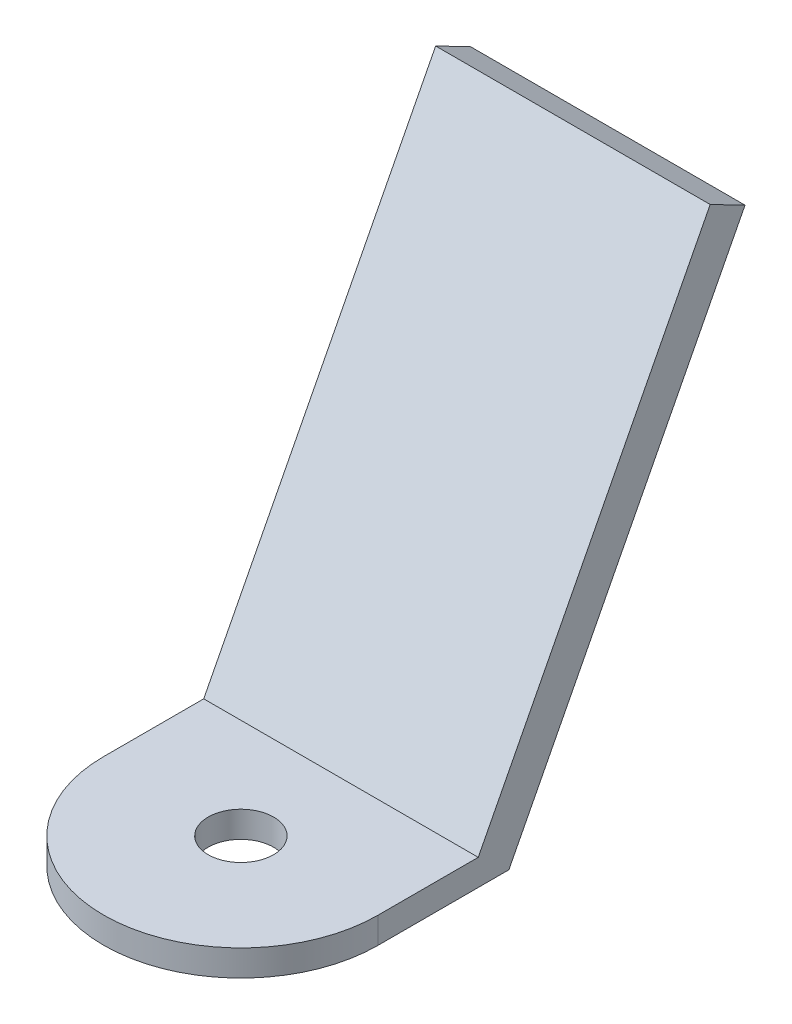
ISO-10303-21;
HEADER;
FILE_DESCRIPTION(('STEP AP214'),'2;1');
FILE_NAME('part.step','',(''),(''),'','','');
FILE_SCHEMA(('AUTOMOTIVE_DESIGN { 1 0 10303 214 1 1 1 1 }'));
ENDSEC;
DATA;
#1=APPLICATION_CONTEXT('core data for automotive mechanical design processes');
#2=APPLICATION_PROTOCOL_DEFINITION('international standard','automotive_design',2000,#1);
#3=PRODUCT_CONTEXT('',#1,'mechanical');
#4=PRODUCT('Part','Part','',(#3));
#5=PRODUCT_RELATED_PRODUCT_CATEGORY('part','',(#4));
#6=PRODUCT_DEFINITION_FORMATION('','',#4);
#7=PRODUCT_DEFINITION_CONTEXT('part definition',#1,'design');
#8=PRODUCT_DEFINITION('design','',#6,#7);
#9=PRODUCT_DEFINITION_SHAPE('','',#8);
#10=(LENGTH_UNIT() NAMED_UNIT(*) SI_UNIT(.MILLI.,.METRE.));
#11=(NAMED_UNIT(*) PLANE_ANGLE_UNIT() SI_UNIT($,.RADIAN.));
#12=(NAMED_UNIT(*) SI_UNIT($,.STERADIAN.) SOLID_ANGLE_UNIT());
#13=UNCERTAINTY_MEASURE_WITH_UNIT(LENGTH_MEASURE(1.E-05),#10,'distance_accuracy_value','');
#14=(GEOMETRIC_REPRESENTATION_CONTEXT(3) GLOBAL_UNCERTAINTY_ASSIGNED_CONTEXT((#13)) GLOBAL_UNIT_ASSIGNED_CONTEXT((#10,
#11,#12)) REPRESENTATION_CONTEXT('',''));
#15=CARTESIAN_POINT('',(0.,0.,0.));
#16=DIRECTION('',(0.,0.,1.));
#17=DIRECTION('',(1.,0.,0.));
#18=AXIS2_PLACEMENT_3D('',#15,#16,#17);
#19=CARTESIAN_POINT('',(0.,2.,0.));
#20=DIRECTION('',(0.,1.,0.));
#21=DIRECTION('',(0.,0.,1.));
#22=AXIS2_PLACEMENT_3D('',#19,#20,#21);
#23=PLANE('',#22);
#24=DIRECTION('',(1.,0.,0.));
#25=VECTOR('',#24,1.);
#26=CARTESIAN_POINT('',(0.,2.,-7.65624979912322));
#27=LINE('',#26,#25);
#28=CARTESIAN_POINT('',(-10.5,1.99999999999999,-7.65624979912322));
#29=VERTEX_POINT('',#28);
#30=CARTESIAN_POINT('',(10.5,1.99999999999999,-7.65624979912322));
#31=VERTEX_POINT('',#30);
#32=EDGE_CURVE('E119',#29,#31,#27,.T.);
#33=ORIENTED_EDGE('',*,*,#32,.F.);
#34=DIRECTION('',(0.,0.,1.));
#35=VECTOR('',#34,1.);
#36=CARTESIAN_POINT('',(-10.5,2.,0.));
#37=LINE('',#36,#35);
#38=CARTESIAN_POINT('',(-10.5,2.,0.));
#39=VERTEX_POINT('',#38);
#40=EDGE_CURVE('E57',#29,#39,#37,.T.);
#41=ORIENTED_EDGE('',*,*,#40,.T.);
#42=CARTESIAN_POINT('',(0.,2.,0.));
#43=DIRECTION('',(0.,1.,0.));
#44=DIRECTION('',(0.,0.,1.));
#45=AXIS2_PLACEMENT_3D('',#42,#43,#44);
#46=CIRCLE('',#45,10.5);
#47=CARTESIAN_POINT('',(10.5,2.,0.));
#48=VERTEX_POINT('',#47);
#49=EDGE_CURVE('E86',#39,#48,#46,.T.);
#50=ORIENTED_EDGE('',*,*,#49,.T.);
#51=DIRECTION('',(0.,0.,-1.));
#52=VECTOR('',#51,1.);
#53=CARTESIAN_POINT('',(10.5,2.,-10.));
#54=LINE('',#53,#52);
#55=EDGE_CURVE('E112',#48,#31,#54,.T.);
#56=ORIENTED_EDGE('',*,*,#55,.T.);
#57=EDGE_LOOP('',(#33,#41,#50,#56));
#58=FACE_BOUND('',#57,.T.);
#59=CARTESIAN_POINT('',(0.,2.,0.));
#60=DIRECTION('',(0.,1.,0.));
#61=DIRECTION('',(0.,0.,1.));
#62=AXIS2_PLACEMENT_3D('',#59,#60,#61);
#63=CIRCLE('',#62,2.5);
#64=CARTESIAN_POINT('',(0.,2.,2.5));
#65=VERTEX_POINT('',#64);
#66=EDGE_CURVE('E98',#65,#65,#63,.T.);
#67=ORIENTED_EDGE('',*,*,#66,.F.);
#68=EDGE_LOOP('',(#67));
#69=FACE_BOUND('',#68,.T.);
#70=ADVANCED_FACE('F39',(#58,#69),#23,.T.);
#71=CARTESIAN_POINT('',(0.,0.,0.));
#72=DIRECTION('',(0.,1.,0.));
#73=DIRECTION('',(0.,0.,1.));
#74=AXIS2_PLACEMENT_3D('',#71,#72,#73);
#75=PLANE('',#74);
#76=CARTESIAN_POINT('',(0.,0.,0.));
#77=DIRECTION('',(0.,1.,0.));
#78=DIRECTION('',(0.,0.,1.));
#79=AXIS2_PLACEMENT_3D('',#76,#77,#78);
#80=CIRCLE('',#79,10.5);
#81=CARTESIAN_POINT('',(-10.5,0.,0.));
#82=VERTEX_POINT('',#81);
#83=CARTESIAN_POINT('',(10.5,0.,0.));
#84=VERTEX_POINT('',#83);
#85=EDGE_CURVE('E91',#82,#84,#80,.T.);
#86=ORIENTED_EDGE('',*,*,#85,.F.);
#87=DIRECTION('',(0.,0.,1.));
#88=VECTOR('',#87,1.);
#89=CARTESIAN_POINT('',(-10.5,0.,0.));
#90=LINE('',#89,#88);
#91=CARTESIAN_POINT('',(-10.5,0.,-10.));
#92=VERTEX_POINT('',#91);
#93=EDGE_CURVE('E77',#92,#82,#90,.T.);
#94=ORIENTED_EDGE('',*,*,#93,.F.);
#95=DIRECTION('',(-1.,0.,0.));
#96=VECTOR('',#95,1.);
#97=CARTESIAN_POINT('',(-10.5,0.,-10.));
#98=LINE('',#97,#96);
#99=CARTESIAN_POINT('',(10.5,0.,-10.));
#100=VERTEX_POINT('',#99);
#101=EDGE_CURVE('E72',#100,#92,#98,.T.);
#102=ORIENTED_EDGE('',*,*,#101,.F.);
#103=DIRECTION('',(0.,0.,-1.));
#104=VECTOR('',#103,1.);
#105=CARTESIAN_POINT('',(10.5,0.,-10.));
#106=LINE('',#105,#104);
#107=EDGE_CURVE('E96',#84,#100,#106,.T.);
#108=ORIENTED_EDGE('',*,*,#107,.F.);
#109=EDGE_LOOP('',(#86,#94,#102,#108));
#110=FACE_BOUND('',#109,.T.);
#111=CARTESIAN_POINT('',(0.,0.,0.));
#112=DIRECTION('',(0.,1.,0.));
#113=DIRECTION('',(0.,0.,1.));
#114=AXIS2_PLACEMENT_3D('',#111,#112,#113);
#115=CIRCLE('',#114,2.5);
#116=CARTESIAN_POINT('',(0.,0.,2.5));
#117=VERTEX_POINT('',#116);
#118=EDGE_CURVE('E104',#117,#117,#115,.T.);
#119=ORIENTED_EDGE('',*,*,#118,.T.);
#120=EDGE_LOOP('',(#119));
#121=FACE_BOUND('',#120,.T.);
#122=ADVANCED_FACE('F93',(#110,#121),#75,.F.);
#123=CARTESIAN_POINT('',(0.,2.,0.));
#124=DIRECTION('',(0.,-1.,0.));
#125=DIRECTION('',(0.,0.,-1.));
#126=AXIS2_PLACEMENT_3D('',#123,#124,#125);
#127=CYLINDRICAL_SURFACE('',#126,10.5);
#128=ORIENTED_EDGE('',*,*,#85,.T.);
#129=DIRECTION('',(0.,-1.,0.));
#130=VECTOR('',#129,1.);
#131=CARTESIAN_POINT('',(10.5,2.,0.));
#132=LINE('',#131,#130);
#133=EDGE_CURVE('E11',#48,#84,#132,.T.);
#134=ORIENTED_EDGE('',*,*,#133,.F.);
#135=ORIENTED_EDGE('',*,*,#49,.F.);
#136=DIRECTION('',(0.,-1.,0.));
#137=VECTOR('',#136,1.);
#138=CARTESIAN_POINT('',(-10.5,2.,0.));
#139=LINE('',#138,#137);
#140=EDGE_CURVE('E49',#39,#82,#139,.T.);
#141=ORIENTED_EDGE('',*,*,#140,.T.);
#142=EDGE_LOOP('',(#128,#134,#135,#141));
#143=FACE_BOUND('',#142,.T.);
#144=ADVANCED_FACE('F41',(#143),#127,.T.);
#145=CARTESIAN_POINT('',(10.5,2.,-10.));
#146=DIRECTION('',(-1.,0.,0.));
#147=DIRECTION('',(0.,0.,1.));
#148=AXIS2_PLACEMENT_3D('',#145,#146,#147);
#149=PLANE('',#148);
#150=ORIENTED_EDGE('',*,*,#107,.T.);
#151=DIRECTION('',(0.,0.888614572242532,-0.458654708902265));
#152=VECTOR('',#151,1.);
#153=CARTESIAN_POINT('',(10.5,19.2,-19.91));
#154=LINE('',#153,#152);
#155=CARTESIAN_POINT('',(10.5,35.,-28.0651041666667));
#156=VERTEX_POINT('',#155);
#157=EDGE_CURVE('E144',#100,#156,#154,.T.);
#158=ORIENTED_EDGE('',*,*,#157,.T.);
#159=DIRECTION('',(0.,0.458654708902266,0.888614572242531));
#160=VECTOR('',#159,1.);
#161=CARTESIAN_POINT('',(10.5,35.,-28.0651041666667));
#162=LINE('',#161,#160);
#163=CARTESIAN_POINT('',(10.5,36.3759641267068,-25.3992604499391));
#164=VERTEX_POINT('',#163);
#165=EDGE_CURVE('E140',#156,#164,#162,.T.);
#166=ORIENTED_EDGE('',*,*,#165,.T.);
#167=DIRECTION('',(0.,-0.888614572242532,0.458654708902265));
#168=VECTOR('',#167,1.);
#169=CARTESIAN_POINT('',(10.5,36.3759641267068,-25.3992604499391));
#170=LINE('',#169,#168);
#171=EDGE_CURVE('E132',#164,#31,#170,.T.);
#172=ORIENTED_EDGE('',*,*,#171,.T.);
#173=ORIENTED_EDGE('',*,*,#55,.F.);
#174=ORIENTED_EDGE('',*,*,#133,.T.);
#175=EDGE_LOOP('',(#150,#158,#166,#172,#173,#174));
#176=FACE_BOUND('',#175,.T.);
#177=ADVANCED_FACE('F183',(#176),#149,.F.);
#178=CARTESIAN_POINT('',(-10.5,2.,0.));
#179=DIRECTION('',(1.,0.,0.));
#180=DIRECTION('',(0.,0.,-1.));
#181=AXIS2_PLACEMENT_3D('',#178,#179,#180);
#182=PLANE('',#181);
#183=ORIENTED_EDGE('',*,*,#40,.F.);
#184=DIRECTION('',(0.,0.888614572242532,-0.458654708902265));
#185=VECTOR('',#184,1.);
#186=CARTESIAN_POINT('',(-10.5,36.3759641267068,-25.3992604499391));
#187=LINE('',#186,#185);
#188=CARTESIAN_POINT('',(-10.5,36.3759641267068,-25.3992604499391));
#189=VERTEX_POINT('',#188);
#190=EDGE_CURVE('E126',#29,#189,#187,.T.);
#191=ORIENTED_EDGE('',*,*,#190,.T.);
#192=DIRECTION('',(0.,-0.458654708902267,-0.888614572242532));
#193=VECTOR('',#192,1.);
#194=CARTESIAN_POINT('',(-10.5,35.,-28.0651041666667));
#195=LINE('',#194,#193);
#196=CARTESIAN_POINT('',(-10.5,35.,-28.0651041666667));
#197=VERTEX_POINT('',#196);
#198=EDGE_CURVE('E136',#189,#197,#195,.T.);
#199=ORIENTED_EDGE('',*,*,#198,.T.);
#200=DIRECTION('',(0.,-0.888614572242532,0.458654708902265));
#201=VECTOR('',#200,1.);
#202=CARTESIAN_POINT('',(-10.5,19.2,-19.91));
#203=LINE('',#202,#201);
#204=EDGE_CURVE('E82',#197,#92,#203,.T.);
#205=ORIENTED_EDGE('',*,*,#204,.T.);
#206=ORIENTED_EDGE('',*,*,#93,.T.);
#207=ORIENTED_EDGE('',*,*,#140,.F.);
#208=EDGE_LOOP('',(#183,#191,#199,#205,#206,#207));
#209=FACE_BOUND('',#208,.T.);
#210=ADVANCED_FACE('F79',(#209),#182,.F.);
#211=CARTESIAN_POINT('',(0.,2.,0.));
#212=DIRECTION('',(0.,-1.,0.));
#213=DIRECTION('',(0.,0.,-1.));
#214=AXIS2_PLACEMENT_3D('',#211,#212,#213);
#215=CYLINDRICAL_SURFACE('',#214,2.5);
#216=ORIENTED_EDGE('',*,*,#66,.T.);
#217=EDGE_LOOP('',(#216));
#218=FACE_BOUND('',#217,.T.);
#219=ORIENTED_EDGE('',*,*,#118,.F.);
#220=EDGE_LOOP('',(#219));
#221=FACE_BOUND('',#220,.T.);
#222=ADVANCED_FACE('F180',(#218,#221),#215,.F.);
#223=CARTESIAN_POINT('',(-52.7247973282026,36.3759641267068,-25.3992604499391));
#224=DIRECTION('',(0.,0.458654708902265,0.888614572242532));
#225=DIRECTION('',(0.,-0.888614572242532,0.458654708902265));
#226=AXIS2_PLACEMENT_3D('',#223,#224,#225);
#227=PLANE('',#226);
#228=ORIENTED_EDGE('',*,*,#190,.F.);
#229=ORIENTED_EDGE('',*,*,#32,.T.);
#230=ORIENTED_EDGE('',*,*,#171,.F.);
#231=DIRECTION('',(1.,0.,0.));
#232=VECTOR('',#231,1.);
#233=CARTESIAN_POINT('',(-52.7247973282026,36.3759641267068,-25.3992604499391));
#234=LINE('',#233,#232);
#235=EDGE_CURVE('E131',#189,#164,#234,.T.);
#236=ORIENTED_EDGE('',*,*,#235,.F.);
#237=EDGE_LOOP('',(#228,#229,#230,#236));
#238=FACE_BOUND('',#237,.T.);
#239=ADVANCED_FACE('F170',(#238),#227,.T.);
#240=CARTESIAN_POINT('',(-52.7247973282026,35.,-28.0651041666667));
#241=DIRECTION('',(0.,0.888614572242531,-0.458654708902266));
#242=DIRECTION('',(0.,0.458654708902267,0.888614572242532));
#243=AXIS2_PLACEMENT_3D('',#240,#241,#242);
#244=PLANE('',#243);
#245=ORIENTED_EDGE('',*,*,#198,.F.);
#246=ORIENTED_EDGE('',*,*,#235,.T.);
#247=ORIENTED_EDGE('',*,*,#165,.F.);
#248=DIRECTION('',(1.,0.,0.));
#249=VECTOR('',#248,1.);
#250=CARTESIAN_POINT('',(-52.7247973282026,35.,-28.0651041666667));
#251=LINE('',#250,#249);
#252=EDGE_CURVE('E127',#197,#156,#251,.T.);
#253=ORIENTED_EDGE('',*,*,#252,.F.);
#254=EDGE_LOOP('',(#245,#246,#247,#253));
#255=FACE_BOUND('',#254,.T.);
#256=ADVANCED_FACE('F162',(#255),#244,.T.);
#257=CARTESIAN_POINT('',(-52.7247973282026,19.2,-19.91));
#258=DIRECTION('',(0.,-0.458654708902265,-0.888614572242532));
#259=DIRECTION('',(0.,0.888614572242532,-0.458654708902265));
#260=AXIS2_PLACEMENT_3D('',#257,#258,#259);
#261=PLANE('',#260);
#262=ORIENTED_EDGE('',*,*,#204,.F.);
#263=ORIENTED_EDGE('',*,*,#252,.T.);
#264=ORIENTED_EDGE('',*,*,#157,.F.);
#265=ORIENTED_EDGE('',*,*,#101,.T.);
#266=EDGE_LOOP('',(#262,#263,#264,#265));
#267=FACE_BOUND('',#266,.T.);
#268=ADVANCED_FACE('F164',(#267),#261,.T.);
#269=CLOSED_SHELL('',(#70,#122,#144,#177,#210,#222,#239,#256,#268));
#270=MANIFOLD_SOLID_BREP('B2',#269);
#271=ADVANCED_BREP_SHAPE_REPRESENTATION('',(#18,#270),#14);
#272=SHAPE_DEFINITION_REPRESENTATION(#9,#271);
ENDSEC;
END-ISO-10303-21;
